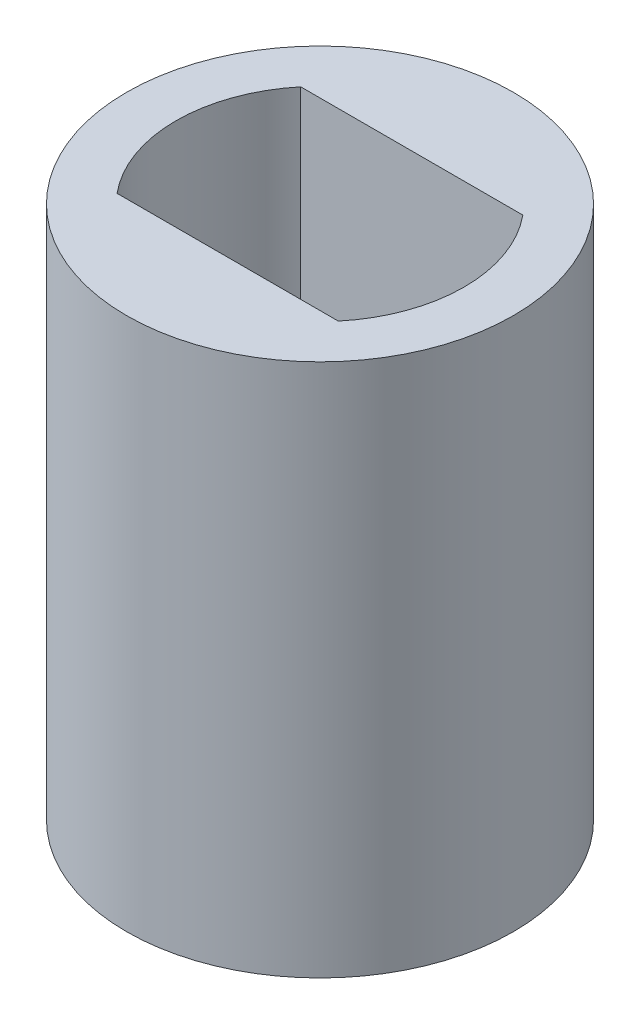
ISO-10303-21;
HEADER;
FILE_DESCRIPTION(('STEP AP214'),'2;1');
FILE_NAME('part.step','',(''),(''),'','','');
FILE_SCHEMA(('AUTOMOTIVE_DESIGN { 1 0 10303 214 1 1 1 1 }'));
ENDSEC;
DATA;
#1=APPLICATION_CONTEXT('core data for automotive mechanical design processes');
#2=APPLICATION_PROTOCOL_DEFINITION('international standard','automotive_design',2000,#1);
#3=PRODUCT_CONTEXT('',#1,'mechanical');
#4=PRODUCT('Part','Part','',(#3));
#5=PRODUCT_RELATED_PRODUCT_CATEGORY('part','',(#4));
#6=PRODUCT_DEFINITION_FORMATION('','',#4);
#7=PRODUCT_DEFINITION_CONTEXT('part definition',#1,'design');
#8=PRODUCT_DEFINITION('design','',#6,#7);
#9=PRODUCT_DEFINITION_SHAPE('','',#8);
#10=(LENGTH_UNIT() NAMED_UNIT(*) SI_UNIT(.MILLI.,.METRE.));
#11=(NAMED_UNIT(*) PLANE_ANGLE_UNIT() SI_UNIT($,.RADIAN.));
#12=(NAMED_UNIT(*) SI_UNIT($,.STERADIAN.) SOLID_ANGLE_UNIT());
#13=UNCERTAINTY_MEASURE_WITH_UNIT(LENGTH_MEASURE(1.E-05),#10,'distance_accuracy_value','');
#14=(GEOMETRIC_REPRESENTATION_CONTEXT(3) GLOBAL_UNCERTAINTY_ASSIGNED_CONTEXT((#13)) GLOBAL_UNIT_ASSIGNED_CONTEXT((#10,
#11,#12)) REPRESENTATION_CONTEXT('',''));
#15=CARTESIAN_POINT('',(0.,0.,0.));
#16=DIRECTION('',(0.,0.,1.));
#17=DIRECTION('',(1.,0.,0.));
#18=AXIS2_PLACEMENT_3D('',#15,#16,#17);
#19=CARTESIAN_POINT('',(0.,10.,0.));
#20=DIRECTION('',(0.,1.,0.));
#21=DIRECTION('',(0.,0.,1.));
#22=AXIS2_PLACEMENT_3D('',#19,#20,#21);
#23=PLANE('',#22);
#24=CARTESIAN_POINT('',(0.,10.,0.));
#25=DIRECTION('',(0.,1.,0.));
#26=DIRECTION('',(0.,0.,1.));
#27=AXIS2_PLACEMENT_3D('',#24,#25,#26);
#28=CIRCLE('',#27,3.625);
#29=CARTESIAN_POINT('',(0.,10.,3.625));
#30=VERTEX_POINT('',#29);
#31=EDGE_CURVE('E11',#30,#30,#28,.T.);
#32=ORIENTED_EDGE('',*,*,#31,.T.);
#33=EDGE_LOOP('',(#32));
#34=FACE_BOUND('',#33,.T.);
#35=DIRECTION('',(-1.,0.,0.));
#36=VECTOR('',#35,1.);
#37=CARTESIAN_POINT('',(-2.08124962462459,10.,-1.72));
#38=LINE('',#37,#36);
#39=CARTESIAN_POINT('',(2.08124962462459,10.,-1.72));
#40=VERTEX_POINT('',#39);
#41=CARTESIAN_POINT('',(-2.08124962462459,10.,-1.72));
#42=VERTEX_POINT('',#41);
#43=EDGE_CURVE('E82',#40,#42,#38,.T.);
#44=ORIENTED_EDGE('',*,*,#43,.F.);
#45=CARTESIAN_POINT('',(0.,10.,0.));
#46=DIRECTION('',(0.,1.,0.));
#47=DIRECTION('',(0.,0.,1.));
#48=AXIS2_PLACEMENT_3D('',#45,#46,#47);
#49=CIRCLE('',#48,2.7);
#50=CARTESIAN_POINT('',(2.07295309062838,10.,1.72999002426437));
#51=VERTEX_POINT('',#50);
#52=EDGE_CURVE('E74',#51,#40,#49,.T.);
#53=ORIENTED_EDGE('',*,*,#52,.F.);
#54=DIRECTION('',(1.,0.,0.));
#55=VECTOR('',#54,1.);
#56=CARTESIAN_POINT('',(-2.07295309062838,10.,1.72999002426437));
#57=LINE('',#56,#55);
#58=CARTESIAN_POINT('',(-2.07295309062838,10.,1.72999002426437));
#59=VERTEX_POINT('',#58);
#60=EDGE_CURVE('E95',#59,#51,#57,.T.);
#61=ORIENTED_EDGE('',*,*,#60,.F.);
#62=CARTESIAN_POINT('',(0.,10.,0.));
#63=DIRECTION('',(0.,1.,0.));
#64=DIRECTION('',(0.,0.,1.));
#65=AXIS2_PLACEMENT_3D('',#62,#63,#64);
#66=CIRCLE('',#65,2.7);
#67=EDGE_CURVE('E93',#42,#59,#66,.T.);
#68=ORIENTED_EDGE('',*,*,#67,.F.);
#69=EDGE_LOOP('',(#44,#53,#61,#68));
#70=FACE_BOUND('',#69,.T.);
#71=ADVANCED_FACE('F33',(#34,#70),#23,.T.);
#72=CARTESIAN_POINT('',(0.,0.,0.));
#73=DIRECTION('',(0.,1.,0.));
#74=DIRECTION('',(0.,0.,1.));
#75=AXIS2_PLACEMENT_3D('',#72,#73,#74);
#76=PLANE('',#75);
#77=CARTESIAN_POINT('',(0.,0.,0.));
#78=DIRECTION('',(0.,1.,0.));
#79=DIRECTION('',(0.,0.,1.));
#80=AXIS2_PLACEMENT_3D('',#77,#78,#79);
#81=CIRCLE('',#80,3.625);
#82=CARTESIAN_POINT('',(0.,0.,3.625));
#83=VERTEX_POINT('',#82);
#84=EDGE_CURVE('E37',#83,#83,#81,.T.);
#85=ORIENTED_EDGE('',*,*,#84,.F.);
#86=EDGE_LOOP('',(#85));
#87=FACE_BOUND('',#86,.T.);
#88=CARTESIAN_POINT('',(0.,0.,0.));
#89=DIRECTION('',(0.,1.,0.));
#90=DIRECTION('',(0.,0.,1.));
#91=AXIS2_PLACEMENT_3D('',#88,#89,#90);
#92=CIRCLE('',#91,2.7);
#93=CARTESIAN_POINT('',(2.07295309062838,0.,1.72999002426437));
#94=VERTEX_POINT('',#93);
#95=CARTESIAN_POINT('',(2.08124962462459,0.,-1.72));
#96=VERTEX_POINT('',#95);
#97=EDGE_CURVE('E56',#94,#96,#92,.T.);
#98=ORIENTED_EDGE('',*,*,#97,.T.);
#99=DIRECTION('',(-1.,0.,0.));
#100=VECTOR('',#99,1.);
#101=CARTESIAN_POINT('',(-2.08124962462459,0.,-1.72));
#102=LINE('',#101,#100);
#103=CARTESIAN_POINT('',(-2.08124962462459,0.,-1.72));
#104=VERTEX_POINT('',#103);
#105=EDGE_CURVE('E89',#96,#104,#102,.T.);
#106=ORIENTED_EDGE('',*,*,#105,.T.);
#107=CARTESIAN_POINT('',(0.,0.,0.));
#108=DIRECTION('',(0.,1.,0.));
#109=DIRECTION('',(0.,0.,1.));
#110=AXIS2_PLACEMENT_3D('',#107,#108,#109);
#111=CIRCLE('',#110,2.7);
#112=CARTESIAN_POINT('',(-2.07295309062838,0.,1.72999002426437));
#113=VERTEX_POINT('',#112);
#114=EDGE_CURVE('E101',#104,#113,#111,.T.);
#115=ORIENTED_EDGE('',*,*,#114,.T.);
#116=DIRECTION('',(1.,0.,0.));
#117=VECTOR('',#116,1.);
#118=CARTESIAN_POINT('',(-2.07295309062838,0.,1.72999002426437));
#119=LINE('',#118,#117);
#120=EDGE_CURVE('E83',#113,#94,#119,.T.);
#121=ORIENTED_EDGE('',*,*,#120,.T.);
#122=EDGE_LOOP('',(#98,#106,#115,#121));
#123=FACE_BOUND('',#122,.T.);
#124=ADVANCED_FACE('F112',(#87,#123),#76,.F.);
#125=CARTESIAN_POINT('',(0.,10.,0.));
#126=DIRECTION('',(0.,-1.,0.));
#127=DIRECTION('',(0.,0.,-1.));
#128=AXIS2_PLACEMENT_3D('',#125,#126,#127);
#129=CYLINDRICAL_SURFACE('',#128,3.625);
#130=ORIENTED_EDGE('',*,*,#31,.F.);
#131=EDGE_LOOP('',(#130));
#132=FACE_BOUND('',#131,.T.);
#133=ORIENTED_EDGE('',*,*,#84,.T.);
#134=EDGE_LOOP('',(#133));
#135=FACE_BOUND('',#134,.T.);
#136=ADVANCED_FACE('F35',(#132,#135),#129,.T.);
#137=CARTESIAN_POINT('',(0.,10.,0.));
#138=DIRECTION('',(0.,-1.,0.));
#139=DIRECTION('',(0.,0.,-1.));
#140=AXIS2_PLACEMENT_3D('',#137,#138,#139);
#141=CYLINDRICAL_SURFACE('',#140,2.7);
#142=ORIENTED_EDGE('',*,*,#97,.F.);
#143=DIRECTION('',(0.,-1.,0.));
#144=VECTOR('',#143,1.);
#145=CARTESIAN_POINT('',(2.07295309062838,10.,1.72999002426437));
#146=LINE('',#145,#144);
#147=EDGE_CURVE('E78',#51,#94,#146,.T.);
#148=ORIENTED_EDGE('',*,*,#147,.F.);
#149=ORIENTED_EDGE('',*,*,#52,.T.);
#150=DIRECTION('',(0.,-1.,0.));
#151=VECTOR('',#150,1.);
#152=CARTESIAN_POINT('',(2.08124962462459,10.,-1.72));
#153=LINE('',#152,#151);
#154=EDGE_CURVE('E77',#40,#96,#153,.T.);
#155=ORIENTED_EDGE('',*,*,#154,.T.);
#156=EDGE_LOOP('',(#142,#148,#149,#155));
#157=FACE_BOUND('',#156,.T.);
#158=ADVANCED_FACE('F76',(#157),#141,.F.);
#159=CARTESIAN_POINT('',(-2.08124962462459,10.,-1.72));
#160=DIRECTION('',(0.,0.,1.));
#161=DIRECTION('',(1.,0.,0.));
#162=AXIS2_PLACEMENT_3D('',#159,#160,#161);
#163=PLANE('',#162);
#164=ORIENTED_EDGE('',*,*,#105,.F.);
#165=ORIENTED_EDGE('',*,*,#154,.F.);
#166=ORIENTED_EDGE('',*,*,#43,.T.);
#167=DIRECTION('',(0.,-1.,0.));
#168=VECTOR('',#167,1.);
#169=CARTESIAN_POINT('',(-2.08124962462459,10.,-1.72));
#170=LINE('',#169,#168);
#171=EDGE_CURVE('E90',#42,#104,#170,.T.);
#172=ORIENTED_EDGE('',*,*,#171,.T.);
#173=EDGE_LOOP('',(#164,#165,#166,#172));
#174=FACE_BOUND('',#173,.T.);
#175=ADVANCED_FACE('F86',(#174),#163,.T.);
#176=CARTESIAN_POINT('',(0.,10.,0.));
#177=DIRECTION('',(0.,-1.,0.));
#178=DIRECTION('',(0.,0.,-1.));
#179=AXIS2_PLACEMENT_3D('',#176,#177,#178);
#180=CYLINDRICAL_SURFACE('',#179,2.7);
#181=ORIENTED_EDGE('',*,*,#114,.F.);
#182=ORIENTED_EDGE('',*,*,#171,.F.);
#183=ORIENTED_EDGE('',*,*,#67,.T.);
#184=DIRECTION('',(0.,-1.,0.));
#185=VECTOR('',#184,1.);
#186=CARTESIAN_POINT('',(-2.07295309062838,10.,1.72999002426437));
#187=LINE('',#186,#185);
#188=EDGE_CURVE('E48',#59,#113,#187,.T.);
#189=ORIENTED_EDGE('',*,*,#188,.T.);
#190=EDGE_LOOP('',(#181,#182,#183,#189));
#191=FACE_BOUND('',#190,.T.);
#192=ADVANCED_FACE('F110',(#191),#180,.F.);
#193=CARTESIAN_POINT('',(-2.07295309062838,10.,1.72999002426437));
#194=DIRECTION('',(0.,0.,-1.));
#195=DIRECTION('',(-1.,0.,0.));
#196=AXIS2_PLACEMENT_3D('',#193,#194,#195);
#197=PLANE('',#196);
#198=ORIENTED_EDGE('',*,*,#120,.F.);
#199=ORIENTED_EDGE('',*,*,#188,.F.);
#200=ORIENTED_EDGE('',*,*,#60,.T.);
#201=ORIENTED_EDGE('',*,*,#147,.T.);
#202=EDGE_LOOP('',(#198,#199,#200,#201));
#203=FACE_BOUND('',#202,.T.);
#204=ADVANCED_FACE('F113',(#203),#197,.T.);
#205=CLOSED_SHELL('',(#71,#124,#136,#158,#175,#192,#204));
#206=MANIFOLD_SOLID_BREP('B2',#205);
#207=ADVANCED_BREP_SHAPE_REPRESENTATION('',(#18,#206),#14);
#208=SHAPE_DEFINITION_REPRESENTATION(#9,#207);
ENDSEC;
END-ISO-10303-21;
